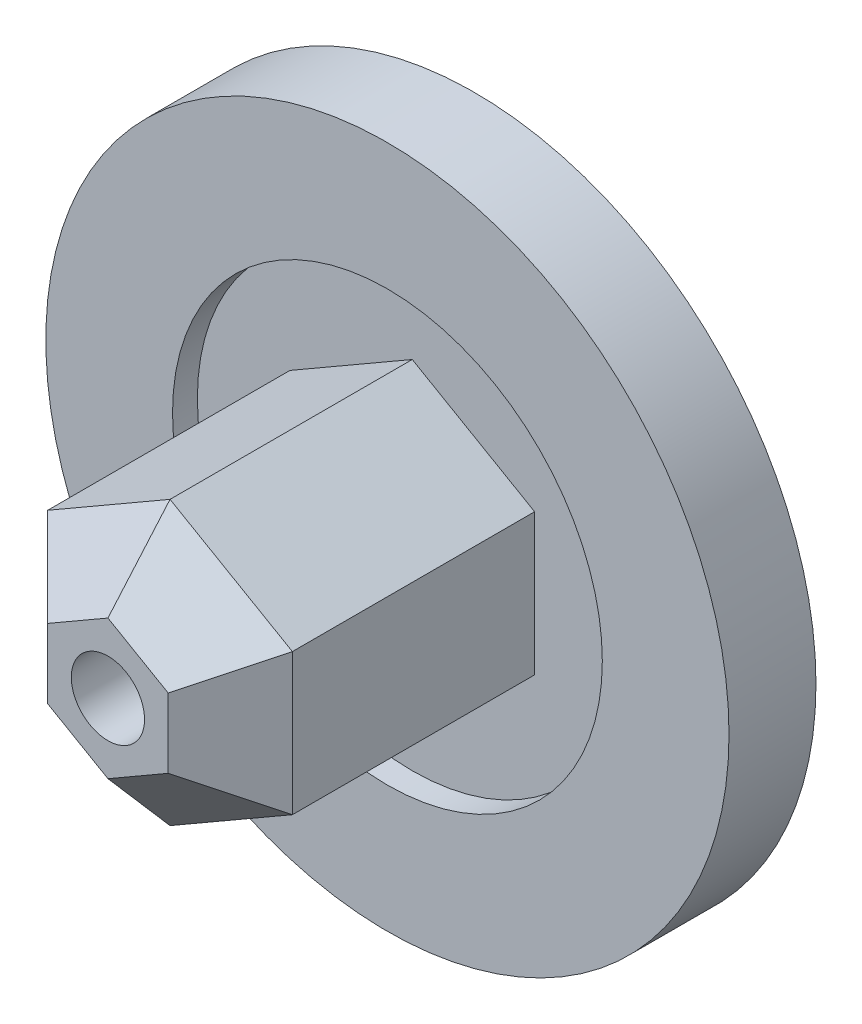
ISO-10303-21;
HEADER;
FILE_DESCRIPTION(('STEP AP214'),'2;1');
FILE_NAME('part.step','',(''),(''),'','','');
FILE_SCHEMA(('AUTOMOTIVE_DESIGN { 1 0 10303 214 1 1 1 1 }'));
ENDSEC;
DATA;
#1=APPLICATION_CONTEXT('core data for automotive mechanical design processes');
#2=APPLICATION_PROTOCOL_DEFINITION('international standard','automotive_design',2000,#1);
#3=PRODUCT_CONTEXT('',#1,'mechanical');
#4=PRODUCT('Part','Part','',(#3));
#5=PRODUCT_RELATED_PRODUCT_CATEGORY('part','',(#4));
#6=PRODUCT_DEFINITION_FORMATION('','',#4);
#7=PRODUCT_DEFINITION_CONTEXT('part definition',#1,'design');
#8=PRODUCT_DEFINITION('design','',#6,#7);
#9=PRODUCT_DEFINITION_SHAPE('','',#8);
#10=(LENGTH_UNIT() NAMED_UNIT(*) SI_UNIT(.MILLI.,.METRE.));
#11=(NAMED_UNIT(*) PLANE_ANGLE_UNIT() SI_UNIT($,.RADIAN.));
#12=(NAMED_UNIT(*) SI_UNIT($,.STERADIAN.) SOLID_ANGLE_UNIT());
#13=UNCERTAINTY_MEASURE_WITH_UNIT(LENGTH_MEASURE(1.E-05),#10,'distance_accuracy_value','');
#14=(GEOMETRIC_REPRESENTATION_CONTEXT(3) GLOBAL_UNCERTAINTY_ASSIGNED_CONTEXT((#13)) GLOBAL_UNIT_ASSIGNED_CONTEXT((#10,
#11,#12)) REPRESENTATION_CONTEXT('',''));
#15=CARTESIAN_POINT('',(0.,0.,0.));
#16=DIRECTION('',(0.,0.,1.));
#17=DIRECTION('',(1.,0.,0.));
#18=AXIS2_PLACEMENT_3D('',#15,#16,#17);
#19=CARTESIAN_POINT('',(0.,0.,0.));
#20=DIRECTION('',(0.,0.,1.));
#21=DIRECTION('',(1.,0.,0.));
#22=AXIS2_PLACEMENT_3D('',#19,#20,#21);
#23=PLANE('',#22);
#24=CARTESIAN_POINT('',(0.,0.,0.));
#25=DIRECTION('',(0.,0.,1.));
#26=DIRECTION('',(1.,0.,0.));
#27=AXIS2_PLACEMENT_3D('',#24,#25,#26);
#28=CIRCLE('',#27,23.25);
#29=CARTESIAN_POINT('',(23.25,0.,0.));
#30=VERTEX_POINT('',#29);
#31=EDGE_CURVE('E47',#30,#30,#28,.F.);
#32=ORIENTED_EDGE('',*,*,#31,.T.);
#33=EDGE_LOOP('',(#32));
#34=FACE_BOUND('',#33,.T.);
#35=CARTESIAN_POINT('',(0.,0.,0.));
#36=DIRECTION('',(0.,0.,-1.));
#37=DIRECTION('',(-1.,0.,0.));
#38=AXIS2_PLACEMENT_3D('',#35,#36,#37);
#39=CIRCLE('',#38,7.05);
#40=CARTESIAN_POINT('',(-7.05,0.,0.));
#41=VERTEX_POINT('',#40);
#42=EDGE_CURVE('E478',#41,#41,#39,.T.);
#43=ORIENTED_EDGE('',*,*,#42,.F.);
#44=EDGE_LOOP('',(#43));
#45=FACE_BOUND('',#44,.T.);
#46=ADVANCED_FACE('F38',(#34,#45),#23,.F.);
#47=CARTESIAN_POINT('',(0.,0.,5.));
#48=DIRECTION('',(0.,0.,1.));
#49=DIRECTION('',(1.,0.,0.));
#50=AXIS2_PLACEMENT_3D('',#47,#48,#49);
#51=PLANE('',#50);
#52=CARTESIAN_POINT('',(0.,0.,5.));
#53=DIRECTION('',(0.,0.,1.));
#54=DIRECTION('',(1.,0.,0.));
#55=AXIS2_PLACEMENT_3D('',#52,#53,#54);
#56=CIRCLE('',#55,17.3);
#57=CARTESIAN_POINT('',(17.3,0.,5.));
#58=VERTEX_POINT('',#57);
#59=EDGE_CURVE('E219',#58,#58,#56,.T.);
#60=ORIENTED_EDGE('',*,*,#59,.T.);
#61=EDGE_LOOP('',(#60));
#62=FACE_BOUND('',#61,.T.);
#63=DIRECTION('',(-0.866025403784439,-0.5,0.));
#64=VECTOR('',#63,1.);
#65=CARTESIAN_POINT('',(0.,11.3738003030356,5.));
#66=LINE('',#65,#64);
#67=CARTESIAN_POINT('',(0.,11.3738003030356,5.));
#68=VERTEX_POINT('',#67);
#69=CARTESIAN_POINT('',(-9.85,5.68690015151781,5.));
#70=VERTEX_POINT('',#69);
#71=EDGE_CURVE('E194',#68,#70,#66,.T.);
#72=ORIENTED_EDGE('',*,*,#71,.F.);
#73=DIRECTION('',(-0.866025403784439,0.5,0.));
#74=VECTOR('',#73,1.);
#75=CARTESIAN_POINT('',(9.84999999999999,5.68690015151782,5.));
#76=LINE('',#75,#74);
#77=CARTESIAN_POINT('',(9.84999999999999,5.68690015151782,5.));
#78=VERTEX_POINT('',#77);
#79=EDGE_CURVE('E190',#78,#68,#76,.T.);
#80=ORIENTED_EDGE('',*,*,#79,.F.);
#81=DIRECTION('',(0.,1.,0.));
#82=VECTOR('',#81,1.);
#83=CARTESIAN_POINT('',(9.85,-5.68690015151781,5.));
#84=LINE('',#83,#82);
#85=CARTESIAN_POINT('',(9.85,-5.68690015151781,5.));
#86=VERTEX_POINT('',#85);
#87=EDGE_CURVE('E81',#86,#78,#84,.T.);
#88=ORIENTED_EDGE('',*,*,#87,.F.);
#89=DIRECTION('',(0.866025403784439,0.5,0.));
#90=VECTOR('',#89,1.);
#91=CARTESIAN_POINT('',(0.,-11.3738003030356,5.));
#92=LINE('',#91,#90);
#93=CARTESIAN_POINT('',(0.,-11.3738003030356,5.));
#94=VERTEX_POINT('',#93);
#95=EDGE_CURVE('E202',#94,#86,#92,.T.);
#96=ORIENTED_EDGE('',*,*,#95,.F.);
#97=DIRECTION('',(0.866025403784439,-0.5,0.));
#98=VECTOR('',#97,1.);
#99=CARTESIAN_POINT('',(-9.85,-5.68690015151782,5.));
#100=LINE('',#99,#98);
#101=CARTESIAN_POINT('',(-9.85,-5.68690015151782,5.));
#102=VERTEX_POINT('',#101);
#103=EDGE_CURVE('E199',#102,#94,#100,.T.);
#104=ORIENTED_EDGE('',*,*,#103,.F.);
#105=DIRECTION('',(0.,-1.,0.));
#106=VECTOR('',#105,1.);
#107=CARTESIAN_POINT('',(-9.85,5.68690015151781,5.));
#108=LINE('',#107,#106);
#109=EDGE_CURVE('E105',#70,#102,#108,.T.);
#110=ORIENTED_EDGE('',*,*,#109,.F.);
#111=EDGE_LOOP('',(#72,#80,#88,#96,#104,#110));
#112=FACE_BOUND('',#111,.T.);
#113=ADVANCED_FACE('F257',(#62,#112),#51,.T.);
#114=CARTESIAN_POINT('',(0.,0.,7.));
#115=DIRECTION('',(0.,0.,-1.));
#116=DIRECTION('',(-1.,0.,0.));
#117=AXIS2_PLACEMENT_3D('',#114,#115,#116);
#118=CYLINDRICAL_SURFACE('',#117,27.5);
#119=CARTESIAN_POINT('',(0.,0.,7.));
#120=DIRECTION('',(0.,0.,1.));
#121=DIRECTION('',(1.,0.,0.));
#122=AXIS2_PLACEMENT_3D('',#119,#120,#121);
#123=CIRCLE('',#122,27.5);
#124=CARTESIAN_POINT('',(27.5,0.,7.));
#125=VERTEX_POINT('',#124);
#126=EDGE_CURVE('E227',#125,#125,#123,.T.);
#127=ORIENTED_EDGE('',*,*,#126,.F.);
#128=EDGE_LOOP('',(#127));
#129=FACE_BOUND('',#128,.T.);
#130=CARTESIAN_POINT('',(0.,0.,0.));
#131=DIRECTION('',(0.,0.,1.));
#132=DIRECTION('',(1.,0.,0.));
#133=AXIS2_PLACEMENT_3D('',#130,#131,#132);
#134=CIRCLE('',#133,27.5);
#135=CARTESIAN_POINT('',(27.5,0.,0.));
#136=VERTEX_POINT('',#135);
#137=EDGE_CURVE('E223',#136,#136,#134,.T.);
#138=ORIENTED_EDGE('',*,*,#137,.T.);
#139=EDGE_LOOP('',(#138));
#140=FACE_BOUND('',#139,.T.);
#141=ADVANCED_FACE('F265',(#129,#140),#118,.T.);
#142=CARTESIAN_POINT('',(0.,0.,7.));
#143=DIRECTION('',(0.,0.,1.));
#144=DIRECTION('',(1.,0.,0.));
#145=AXIS2_PLACEMENT_3D('',#142,#143,#144);
#146=PLANE('',#145);
#147=CARTESIAN_POINT('',(0.,0.,7.));
#148=DIRECTION('',(0.,0.,1.));
#149=DIRECTION('',(1.,0.,0.));
#150=AXIS2_PLACEMENT_3D('',#147,#148,#149);
#151=CIRCLE('',#150,17.3);
#152=CARTESIAN_POINT('',(17.3,0.,7.));
#153=VERTEX_POINT('',#152);
#154=EDGE_CURVE('E218',#153,#153,#151,.T.);
#155=ORIENTED_EDGE('',*,*,#154,.F.);
#156=EDGE_LOOP('',(#155));
#157=FACE_BOUND('',#156,.T.);
#158=ORIENTED_EDGE('',*,*,#126,.T.);
#159=EDGE_LOOP('',(#158));
#160=FACE_BOUND('',#159,.T.);
#161=ADVANCED_FACE('F271',(#157,#160),#146,.T.);
#162=CARTESIAN_POINT('',(0.,0.,0.));
#163=DIRECTION('',(0.,0.,1.));
#164=DIRECTION('',(1.,0.,0.));
#165=AXIS2_PLACEMENT_3D('',#162,#163,#164);
#166=CIRCLE('',#165,26.05);
#167=CARTESIAN_POINT('',(26.05,0.,0.));
#168=VERTEX_POINT('',#167);
#169=EDGE_CURVE('E238',#168,#168,#166,.T.);
#170=ORIENTED_EDGE('',*,*,#169,.T.);
#171=EDGE_LOOP('',(#170));
#172=FACE_BOUND('',#171,.T.);
#173=ORIENTED_EDGE('',*,*,#137,.F.);
#174=EDGE_LOOP('',(#173));
#175=FACE_BOUND('',#174,.T.);
#176=ADVANCED_FACE('F259',(#172,#175),#23,.F.);
#177=CARTESIAN_POINT('',(0.,0.,5.));
#178=DIRECTION('',(0.,0.,1.));
#179=DIRECTION('',(1.,0.,0.));
#180=AXIS2_PLACEMENT_3D('',#177,#178,#179);
#181=CYLINDRICAL_SURFACE('',#180,17.3);
#182=ORIENTED_EDGE('',*,*,#59,.F.);
#183=EDGE_LOOP('',(#182));
#184=FACE_BOUND('',#183,.T.);
#185=ORIENTED_EDGE('',*,*,#154,.T.);
#186=EDGE_LOOP('',(#185));
#187=FACE_BOUND('',#186,.T.);
#188=ADVANCED_FACE('F270',(#184,#187),#181,.F.);
#189=CARTESIAN_POINT('',(9.84999999999999,5.68690015151782,24.5));
#190=DIRECTION('',(-0.5,-0.866025403784439,0.));
#191=DIRECTION('',(0.866025403784439,-0.5,0.));
#192=AXIS2_PLACEMENT_3D('',#189,#190,#191);
#193=PLANE('',#192);
#194=ORIENTED_EDGE('',*,*,#79,.T.);
#195=DIRECTION('',(0.,0.,-1.));
#196=VECTOR('',#195,1.);
#197=CARTESIAN_POINT('',(0.,11.3738003030356,24.5));
#198=LINE('',#197,#196);
#199=CARTESIAN_POINT('',(0.,11.3738003030356,24.5));
#200=VERTEX_POINT('',#199);
#201=EDGE_CURVE('E215',#200,#68,#198,.T.);
#202=ORIENTED_EDGE('',*,*,#201,.F.);
#203=DIRECTION('',(-0.866025403784439,0.5,0.));
#204=VECTOR('',#203,1.);
#205=CARTESIAN_POINT('',(9.84999999999999,5.68690015151782,24.5));
#206=LINE('',#205,#204);
#207=CARTESIAN_POINT('',(9.84999999999999,5.68690015151782,24.5));
#208=VERTEX_POINT('',#207);
#209=EDGE_CURVE('E176',#208,#200,#206,.T.);
#210=ORIENTED_EDGE('',*,*,#209,.F.);
#211=DIRECTION('',(0.,0.,-1.));
#212=VECTOR('',#211,1.);
#213=CARTESIAN_POINT('',(9.84999999999999,5.68690015151782,24.5));
#214=LINE('',#213,#212);
#215=EDGE_CURVE('E189',#208,#78,#214,.T.);
#216=ORIENTED_EDGE('',*,*,#215,.T.);
#217=EDGE_LOOP('',(#194,#202,#210,#216));
#218=FACE_BOUND('',#217,.T.);
#219=ADVANCED_FACE('F277',(#218),#193,.F.);
#220=CARTESIAN_POINT('',(0.,11.3738003030356,24.5));
#221=DIRECTION('',(0.5,-0.866025403784439,0.));
#222=DIRECTION('',(0.866025403784439,0.5,0.));
#223=AXIS2_PLACEMENT_3D('',#220,#221,#222);
#224=PLANE('',#223);
#225=ORIENTED_EDGE('',*,*,#71,.T.);
#226=DIRECTION('',(0.,0.,-1.));
#227=VECTOR('',#226,1.);
#228=CARTESIAN_POINT('',(-9.85,5.68690015151781,24.5));
#229=LINE('',#228,#227);
#230=CARTESIAN_POINT('',(-9.85,5.68690015151781,24.5));
#231=VERTEX_POINT('',#230);
#232=EDGE_CURVE('E109',#231,#70,#229,.T.);
#233=ORIENTED_EDGE('',*,*,#232,.F.);
#234=DIRECTION('',(-0.866025403784439,-0.5,0.));
#235=VECTOR('',#234,1.);
#236=CARTESIAN_POINT('',(0.,11.3738003030356,24.5));
#237=LINE('',#236,#235);
#238=EDGE_CURVE('E89',#200,#231,#237,.T.);
#239=ORIENTED_EDGE('',*,*,#238,.F.);
#240=ORIENTED_EDGE('',*,*,#201,.T.);
#241=EDGE_LOOP('',(#225,#233,#239,#240));
#242=FACE_BOUND('',#241,.T.);
#243=ADVANCED_FACE('F312',(#242),#224,.F.);
#244=CARTESIAN_POINT('',(-9.85,5.68690015151781,24.5));
#245=DIRECTION('',(1.,0.,0.));
#246=DIRECTION('',(0.,1.,0.));
#247=AXIS2_PLACEMENT_3D('',#244,#245,#246);
#248=PLANE('',#247);
#249=ORIENTED_EDGE('',*,*,#109,.T.);
#250=DIRECTION('',(0.,0.,-1.));
#251=VECTOR('',#250,1.);
#252=CARTESIAN_POINT('',(-9.85,-5.68690015151782,24.5));
#253=LINE('',#252,#251);
#254=CARTESIAN_POINT('',(-9.85,-5.68690015151782,24.5));
#255=VERTEX_POINT('',#254);
#256=EDGE_CURVE('E98',#255,#102,#253,.T.);
#257=ORIENTED_EDGE('',*,*,#256,.F.);
#258=DIRECTION('',(0.,-1.,0.));
#259=VECTOR('',#258,1.);
#260=CARTESIAN_POINT('',(-9.85,5.68690015151781,24.5));
#261=LINE('',#260,#259);
#262=EDGE_CURVE('E103',#231,#255,#261,.T.);
#263=ORIENTED_EDGE('',*,*,#262,.F.);
#264=ORIENTED_EDGE('',*,*,#232,.T.);
#265=EDGE_LOOP('',(#249,#257,#263,#264));
#266=FACE_BOUND('',#265,.T.);
#267=ADVANCED_FACE('F100',(#266),#248,.F.);
#268=CARTESIAN_POINT('',(-9.85,-5.68690015151782,24.5));
#269=DIRECTION('',(0.5,0.866025403784439,0.));
#270=DIRECTION('',(-0.866025403784439,0.5,0.));
#271=AXIS2_PLACEMENT_3D('',#268,#269,#270);
#272=PLANE('',#271);
#273=ORIENTED_EDGE('',*,*,#103,.T.);
#274=DIRECTION('',(0.,0.,-1.));
#275=VECTOR('',#274,1.);
#276=CARTESIAN_POINT('',(0.,-11.3738003030356,24.5));
#277=LINE('',#276,#275);
#278=CARTESIAN_POINT('',(0.,-11.3738003030356,24.5));
#279=VERTEX_POINT('',#278);
#280=EDGE_CURVE('E110',#279,#94,#277,.T.);
#281=ORIENTED_EDGE('',*,*,#280,.F.);
#282=DIRECTION('',(0.866025403784439,-0.5,0.));
#283=VECTOR('',#282,1.);
#284=CARTESIAN_POINT('',(-9.85,-5.68690015151782,24.5));
#285=LINE('',#284,#283);
#286=EDGE_CURVE('E113',#255,#279,#285,.T.);
#287=ORIENTED_EDGE('',*,*,#286,.F.);
#288=ORIENTED_EDGE('',*,*,#256,.T.);
#289=EDGE_LOOP('',(#273,#281,#287,#288));
#290=FACE_BOUND('',#289,.T.);
#291=ADVANCED_FACE('F114',(#290),#272,.F.);
#292=CARTESIAN_POINT('',(0.,-11.3738003030356,24.5));
#293=DIRECTION('',(-0.5,0.866025403784439,0.));
#294=DIRECTION('',(-0.866025403784439,-0.5,0.));
#295=AXIS2_PLACEMENT_3D('',#292,#293,#294);
#296=PLANE('',#295);
#297=ORIENTED_EDGE('',*,*,#95,.T.);
#298=DIRECTION('',(0.,0.,-1.));
#299=VECTOR('',#298,1.);
#300=CARTESIAN_POINT('',(9.85,-5.68690015151781,24.5));
#301=LINE('',#300,#299);
#302=CARTESIAN_POINT('',(9.85,-5.68690015151781,24.5));
#303=VERTEX_POINT('',#302);
#304=EDGE_CURVE('E54',#303,#86,#301,.T.);
#305=ORIENTED_EDGE('',*,*,#304,.F.);
#306=DIRECTION('',(0.866025403784439,0.5,0.));
#307=VECTOR('',#306,1.);
#308=CARTESIAN_POINT('',(0.,-11.3738003030356,24.5));
#309=LINE('',#308,#307);
#310=EDGE_CURVE('E121',#279,#303,#309,.T.);
#311=ORIENTED_EDGE('',*,*,#310,.F.);
#312=ORIENTED_EDGE('',*,*,#280,.T.);
#313=EDGE_LOOP('',(#297,#305,#311,#312));
#314=FACE_BOUND('',#313,.T.);
#315=ADVANCED_FACE('F332',(#314),#296,.F.);
#316=CARTESIAN_POINT('',(9.85,-5.68690015151781,24.5));
#317=DIRECTION('',(-1.,0.,0.));
#318=DIRECTION('',(0.,-1.,0.));
#319=AXIS2_PLACEMENT_3D('',#316,#317,#318);
#320=PLANE('',#319);
#321=ORIENTED_EDGE('',*,*,#87,.T.);
#322=ORIENTED_EDGE('',*,*,#215,.F.);
#323=DIRECTION('',(0.,1.,0.));
#324=VECTOR('',#323,1.);
#325=CARTESIAN_POINT('',(9.85,-5.68690015151781,24.5));
#326=LINE('',#325,#324);
#327=EDGE_CURVE('E185',#303,#208,#326,.T.);
#328=ORIENTED_EDGE('',*,*,#327,.F.);
#329=ORIENTED_EDGE('',*,*,#304,.T.);
#330=EDGE_LOOP('',(#321,#322,#328,#329));
#331=FACE_BOUND('',#330,.T.);
#332=ADVANCED_FACE('F339',(#331),#320,.F.);
#333=CARTESIAN_POINT('',(9.85,-5.68690015151781,24.5));
#334=DIRECTION('',(0.707106781186546,0.,0.707106781186549));
#335=DIRECTION('',(0.707106781186549,0.,-0.707106781186546));
#336=AXIS2_PLACEMENT_3D('',#333,#334,#335);
#337=PLANE('',#336);
#338=ORIENTED_EDGE('',*,*,#327,.T.);
#339=DIRECTION('',(0.654653670707978,0.377964473009228,-0.654653670707976));
#340=VECTOR('',#339,1.);
#341=CARTESIAN_POINT('',(9.84999999999999,5.68690015151782,24.5));
#342=LINE('',#341,#340);
#343=CARTESIAN_POINT('',(4.84999999999998,2.80014880556968,29.5));
#344=VERTEX_POINT('',#343);
#345=EDGE_CURVE('E152',#344,#208,#342,.T.);
#346=ORIENTED_EDGE('',*,*,#345,.F.);
#347=DIRECTION('',(0.,-1.,0.));
#348=VECTOR('',#347,1.);
#349=CARTESIAN_POINT('',(4.84999999999998,-5.68690015151782,29.5));
#350=LINE('',#349,#348);
#351=CARTESIAN_POINT('',(4.84999999999998,-2.80014880556968,29.5));
#352=VERTEX_POINT('',#351);
#353=EDGE_CURVE('E153',#352,#344,#350,.F.);
#354=ORIENTED_EDGE('',*,*,#353,.F.);
#355=DIRECTION('',(0.654653670707978,-0.377964473009228,-0.654653670707976));
#356=VECTOR('',#355,1.);
#357=CARTESIAN_POINT('',(9.85,-5.68690015151781,24.5));
#358=LINE('',#357,#356);
#359=EDGE_CURVE('E145',#352,#303,#358,.T.);
#360=ORIENTED_EDGE('',*,*,#359,.T.);
#361=EDGE_LOOP('',(#338,#346,#354,#360));
#362=FACE_BOUND('',#361,.T.);
#363=ADVANCED_FACE('F346',(#362),#337,.T.);
#364=CARTESIAN_POINT('',(9.84999999999999,5.68690015151782,24.5));
#365=DIRECTION('',(0.353553390593273,0.612372435695794,0.707106781186549));
#366=DIRECTION('',(0.,-0.755928946018456,0.654653670707976));
#367=AXIS2_PLACEMENT_3D('',#364,#365,#366);
#368=PLANE('',#367);
#369=ORIENTED_EDGE('',*,*,#209,.T.);
#370=DIRECTION('',(0.,0.755928946018456,-0.654653670707976));
#371=VECTOR('',#370,1.);
#372=CARTESIAN_POINT('',(0.,11.3738003030356,24.5));
#373=LINE('',#372,#371);
#374=CARTESIAN_POINT('',(0.,5.60029761113935,29.5));
#375=VERTEX_POINT('',#374);
#376=EDGE_CURVE('E143',#375,#200,#373,.T.);
#377=ORIENTED_EDGE('',*,*,#376,.F.);
#378=DIRECTION('',(0.866025403784439,-0.5,0.));
#379=VECTOR('',#378,1.);
#380=CARTESIAN_POINT('',(7.34999999999999,1.35677313259561,29.5));
#381=LINE('',#380,#379);
#382=EDGE_CURVE('E157',#344,#375,#381,.F.);
#383=ORIENTED_EDGE('',*,*,#382,.F.);
#384=ORIENTED_EDGE('',*,*,#345,.T.);
#385=EDGE_LOOP('',(#369,#377,#383,#384));
#386=FACE_BOUND('',#385,.T.);
#387=ADVANCED_FACE('F353',(#386),#368,.T.);
#388=CARTESIAN_POINT('',(0.,11.3738003030356,24.5));
#389=DIRECTION('',(-0.353553390593273,0.612372435695793,0.707106781186549));
#390=DIRECTION('',(0.,-0.755928946018456,0.654653670707976));
#391=AXIS2_PLACEMENT_3D('',#388,#389,#390);
#392=PLANE('',#391);
#393=ORIENTED_EDGE('',*,*,#238,.T.);
#394=DIRECTION('',(-0.654653670707978,0.377964473009228,-0.654653670707976));
#395=VECTOR('',#394,1.);
#396=CARTESIAN_POINT('',(-9.85,5.68690015151781,24.5));
#397=LINE('',#396,#395);
#398=CARTESIAN_POINT('',(-4.84999999999998,2.80014880556967,29.5));
#399=VERTEX_POINT('',#398);
#400=EDGE_CURVE('E132',#399,#231,#397,.T.);
#401=ORIENTED_EDGE('',*,*,#400,.F.);
#402=DIRECTION('',(0.866025403784439,0.5,0.));
#403=VECTOR('',#402,1.);
#404=CARTESIAN_POINT('',(2.50000000000001,7.04367328411342,29.5));
#405=LINE('',#404,#403);
#406=EDGE_CURVE('E162',#375,#399,#405,.F.);
#407=ORIENTED_EDGE('',*,*,#406,.F.);
#408=ORIENTED_EDGE('',*,*,#376,.T.);
#409=EDGE_LOOP('',(#393,#401,#407,#408));
#410=FACE_BOUND('',#409,.T.);
#411=ADVANCED_FACE('F361',(#410),#392,.T.);
#412=CARTESIAN_POINT('',(-9.85,5.68690015151781,24.5));
#413=DIRECTION('',(-0.707106781186546,0.,0.707106781186549));
#414=DIRECTION('',(0.707106781186549,0.,0.707106781186546));
#415=AXIS2_PLACEMENT_3D('',#412,#413,#414);
#416=PLANE('',#415);
#417=ORIENTED_EDGE('',*,*,#262,.T.);
#418=DIRECTION('',(-0.654653670707978,-0.377964473009228,-0.654653670707976));
#419=VECTOR('',#418,1.);
#420=CARTESIAN_POINT('',(-9.85,-5.68690015151782,24.5));
#421=LINE('',#420,#419);
#422=CARTESIAN_POINT('',(-4.84999999999998,-2.80014880556968,29.5));
#423=VERTEX_POINT('',#422);
#424=EDGE_CURVE('E129',#423,#255,#421,.T.);
#425=ORIENTED_EDGE('',*,*,#424,.F.);
#426=DIRECTION('',(0.,1.,0.));
#427=VECTOR('',#426,1.);
#428=CARTESIAN_POINT('',(-4.84999999999998,5.68690015151782,29.5));
#429=LINE('',#428,#427);
#430=EDGE_CURVE('E166',#399,#423,#429,.F.);
#431=ORIENTED_EDGE('',*,*,#430,.F.);
#432=ORIENTED_EDGE('',*,*,#400,.T.);
#433=EDGE_LOOP('',(#417,#425,#431,#432));
#434=FACE_BOUND('',#433,.T.);
#435=ADVANCED_FACE('F126',(#434),#416,.T.);
#436=CARTESIAN_POINT('',(-9.85,-5.68690015151782,24.5));
#437=DIRECTION('',(-0.353553390593273,-0.612372435695793,0.707106781186549));
#438=DIRECTION('',(0.,-0.755928946018456,-0.654653670707976));
#439=AXIS2_PLACEMENT_3D('',#436,#437,#438);
#440=PLANE('',#439);
#441=ORIENTED_EDGE('',*,*,#286,.T.);
#442=DIRECTION('',(0.,-0.755928946018456,-0.654653670707976));
#443=VECTOR('',#442,1.);
#444=CARTESIAN_POINT('',(0.,-11.3738003030356,24.5));
#445=LINE('',#444,#443);
#446=CARTESIAN_POINT('',(0.,-5.60029761113935,29.5));
#447=VERTEX_POINT('',#446);
#448=EDGE_CURVE('E139',#447,#279,#445,.T.);
#449=ORIENTED_EDGE('',*,*,#448,.F.);
#450=DIRECTION('',(-0.866025403784439,0.5,0.));
#451=VECTOR('',#450,1.);
#452=CARTESIAN_POINT('',(-7.34999999999999,-1.35677313259561,29.5));
#453=LINE('',#452,#451);
#454=EDGE_CURVE('E137',#423,#447,#453,.F.);
#455=ORIENTED_EDGE('',*,*,#454,.F.);
#456=ORIENTED_EDGE('',*,*,#424,.T.);
#457=EDGE_LOOP('',(#441,#449,#455,#456));
#458=FACE_BOUND('',#457,.T.);
#459=ADVANCED_FACE('F135',(#458),#440,.T.);
#460=CARTESIAN_POINT('',(0.,-11.3738003030356,24.5));
#461=DIRECTION('',(0.353553390593273,-0.612372435695793,0.707106781186549));
#462=DIRECTION('',(0.,-0.755928946018456,-0.654653670707976));
#463=AXIS2_PLACEMENT_3D('',#460,#461,#462);
#464=PLANE('',#463);
#465=ORIENTED_EDGE('',*,*,#310,.T.);
#466=ORIENTED_EDGE('',*,*,#359,.F.);
#467=DIRECTION('',(-0.866025403784439,-0.5,0.));
#468=VECTOR('',#467,1.);
#469=CARTESIAN_POINT('',(-2.50000000000001,-7.04367328411342,29.5));
#470=LINE('',#469,#468);
#471=EDGE_CURVE('E172',#447,#352,#470,.F.);
#472=ORIENTED_EDGE('',*,*,#471,.F.);
#473=ORIENTED_EDGE('',*,*,#448,.T.);
#474=EDGE_LOOP('',(#465,#466,#472,#473));
#475=FACE_BOUND('',#474,.T.);
#476=ADVANCED_FACE('F382',(#475),#464,.T.);
#477=CARTESIAN_POINT('',(0.,0.,29.5));
#478=DIRECTION('',(0.,0.,1.));
#479=DIRECTION('',(1.,0.,0.));
#480=AXIS2_PLACEMENT_3D('',#477,#478,#479);
#481=PLANE('',#480);
#482=CARTESIAN_POINT('',(0.,0.,29.5));
#483=DIRECTION('',(0.,0.,-1.));
#484=DIRECTION('',(-1.,0.,0.));
#485=AXIS2_PLACEMENT_3D('',#482,#483,#484);
#486=CIRCLE('',#485,2.95);
#487=CARTESIAN_POINT('',(-2.95,0.,29.5));
#488=VERTEX_POINT('',#487);
#489=EDGE_CURVE('E474',#488,#488,#486,.T.);
#490=ORIENTED_EDGE('',*,*,#489,.T.);
#491=EDGE_LOOP('',(#490));
#492=FACE_BOUND('',#491,.T.);
#493=ORIENTED_EDGE('',*,*,#353,.T.);
#494=ORIENTED_EDGE('',*,*,#382,.T.);
#495=ORIENTED_EDGE('',*,*,#406,.T.);
#496=ORIENTED_EDGE('',*,*,#430,.T.);
#497=ORIENTED_EDGE('',*,*,#454,.T.);
#498=ORIENTED_EDGE('',*,*,#471,.T.);
#499=EDGE_LOOP('',(#493,#494,#495,#496,#497,#498));
#500=FACE_BOUND('',#499,.T.);
#501=ADVANCED_FACE('F389',(#492,#500),#481,.T.);
#502=CARTESIAN_POINT('',(0.,0.,16.5));
#503=DIRECTION('',(0.,0.,-1.));
#504=DIRECTION('',(-1.,0.,0.));
#505=AXIS2_PLACEMENT_3D('',#502,#503,#504);
#506=CYLINDRICAL_SURFACE('',#505,7.05);
#507=CARTESIAN_POINT('',(0.,0.,16.5));
#508=DIRECTION('',(0.,0.,-1.));
#509=DIRECTION('',(-1.,0.,0.));
#510=AXIS2_PLACEMENT_3D('',#507,#508,#509);
#511=CIRCLE('',#510,7.05);
#512=CARTESIAN_POINT('',(-7.05,0.,16.5));
#513=VERTEX_POINT('',#512);
#514=EDGE_CURVE('E158',#513,#513,#511,.T.);
#515=ORIENTED_EDGE('',*,*,#514,.F.);
#516=EDGE_LOOP('',(#515));
#517=FACE_BOUND('',#516,.T.);
#518=ORIENTED_EDGE('',*,*,#42,.T.);
#519=EDGE_LOOP('',(#518));
#520=FACE_BOUND('',#519,.T.);
#521=ADVANCED_FACE('F398',(#517,#520),#506,.F.);
#522=CARTESIAN_POINT('',(0.,0.,16.5));
#523=DIRECTION('',(0.,0.,-1.));
#524=DIRECTION('',(-1.,0.,0.));
#525=AXIS2_PLACEMENT_3D('',#522,#523,#524);
#526=PLANE('',#525);
#527=CARTESIAN_POINT('',(0.,0.,16.5));
#528=DIRECTION('',(0.,0.,-1.));
#529=DIRECTION('',(-1.,0.,0.));
#530=AXIS2_PLACEMENT_3D('',#527,#528,#529);
#531=CIRCLE('',#530,2.95);
#532=CARTESIAN_POINT('',(-2.95,0.,16.5));
#533=VERTEX_POINT('',#532);
#534=EDGE_CURVE('E471',#533,#533,#531,.T.);
#535=ORIENTED_EDGE('',*,*,#534,.F.);
#536=EDGE_LOOP('',(#535));
#537=FACE_BOUND('',#536,.T.);
#538=ORIENTED_EDGE('',*,*,#514,.T.);
#539=EDGE_LOOP('',(#538));
#540=FACE_BOUND('',#539,.T.);
#541=ADVANCED_FACE('F406',(#537,#540),#526,.T.);
#542=CARTESIAN_POINT('',(0.,0.,29.5));
#543=DIRECTION('',(0.,0.,-1.));
#544=DIRECTION('',(-1.,0.,0.));
#545=AXIS2_PLACEMENT_3D('',#542,#543,#544);
#546=CYLINDRICAL_SURFACE('',#545,2.95);
#547=ORIENTED_EDGE('',*,*,#489,.F.);
#548=EDGE_LOOP('',(#547));
#549=FACE_BOUND('',#548,.T.);
#550=ORIENTED_EDGE('',*,*,#534,.T.);
#551=EDGE_LOOP('',(#550));
#552=FACE_BOUND('',#551,.T.);
#553=ADVANCED_FACE('F413',(#549,#552),#546,.F.);
#554=CARTESIAN_POINT('',(0.,0.,5.));
#555=DIRECTION('',(0.,0.,-1.));
#556=DIRECTION('',(-1.,0.,0.));
#557=AXIS2_PLACEMENT_3D('',#554,#555,#556);
#558=CYLINDRICAL_SURFACE('',#557,25.55);
#559=CARTESIAN_POINT('',(0.,0.,0.499999999999976));
#560=DIRECTION('',(0.,0.,1.));
#561=DIRECTION('',(1.,0.,0.));
#562=AXIS2_PLACEMENT_3D('',#559,#560,#561);
#563=CIRCLE('',#562,25.55);
#564=CARTESIAN_POINT('',(25.55,0.,0.499999999999976));
#565=VERTEX_POINT('',#564);
#566=EDGE_CURVE('E231',#565,#565,#563,.F.);
#567=ORIENTED_EDGE('',*,*,#566,.T.);
#568=EDGE_LOOP('',(#567));
#569=FACE_BOUND('',#568,.T.);
#570=CARTESIAN_POINT('',(0.,0.,5.));
#571=DIRECTION('',(0.,0.,-1.));
#572=DIRECTION('',(-1.,0.,0.));
#573=AXIS2_PLACEMENT_3D('',#570,#571,#572);
#574=CIRCLE('',#573,25.55);
#575=CARTESIAN_POINT('',(-25.55,0.,5.));
#576=VERTEX_POINT('',#575);
#577=EDGE_CURVE('E467',#576,#576,#574,.T.);
#578=ORIENTED_EDGE('',*,*,#577,.F.);
#579=EDGE_LOOP('',(#578));
#580=FACE_BOUND('',#579,.T.);
#581=ADVANCED_FACE('F421',(#569,#580),#558,.F.);
#582=CARTESIAN_POINT('',(0.,0.,5.));
#583=DIRECTION('',(0.,0.,-1.));
#584=DIRECTION('',(-1.,0.,0.));
#585=AXIS2_PLACEMENT_3D('',#582,#583,#584);
#586=PLANE('',#585);
#587=CARTESIAN_POINT('',(0.,0.,5.));
#588=DIRECTION('',(0.,0.,-1.));
#589=DIRECTION('',(-1.,0.,0.));
#590=AXIS2_PLACEMENT_3D('',#587,#588,#589);
#591=CIRCLE('',#590,23.75);
#592=CARTESIAN_POINT('',(-23.75,0.,5.));
#593=VERTEX_POINT('',#592);
#594=EDGE_CURVE('E465',#593,#593,#591,.T.);
#595=ORIENTED_EDGE('',*,*,#594,.F.);
#596=EDGE_LOOP('',(#595));
#597=FACE_BOUND('',#596,.T.);
#598=ORIENTED_EDGE('',*,*,#577,.T.);
#599=EDGE_LOOP('',(#598));
#600=FACE_BOUND('',#599,.T.);
#601=ADVANCED_FACE('F429',(#597,#600),#586,.T.);
#602=CARTESIAN_POINT('',(0.,0.,5.));
#603=DIRECTION('',(0.,0.,-1.));
#604=DIRECTION('',(-1.,0.,0.));
#605=AXIS2_PLACEMENT_3D('',#602,#603,#604);
#606=CYLINDRICAL_SURFACE('',#605,23.75);
#607=CARTESIAN_POINT('',(0.,0.,0.500000000000011));
#608=DIRECTION('',(0.,0.,1.));
#609=DIRECTION('',(1.,0.,0.));
#610=AXIS2_PLACEMENT_3D('',#607,#608,#609);
#611=CIRCLE('',#610,23.75);
#612=CARTESIAN_POINT('',(23.75,0.,0.500000000000011));
#613=VERTEX_POINT('',#612);
#614=EDGE_CURVE('E11',#613,#613,#611,.T.);
#615=ORIENTED_EDGE('',*,*,#614,.T.);
#616=EDGE_LOOP('',(#615));
#617=FACE_BOUND('',#616,.T.);
#618=ORIENTED_EDGE('',*,*,#594,.T.);
#619=EDGE_LOOP('',(#618));
#620=FACE_BOUND('',#619,.T.);
#621=ADVANCED_FACE('F253',(#617,#620),#606,.T.);
#622=CARTESIAN_POINT('',(0.,0.,0.499999999999976));
#623=DIRECTION('',(0.,0.,-1.));
#624=DIRECTION('',(-1.,0.,0.));
#625=AXIS2_PLACEMENT_3D('',#622,#623,#624);
#626=CONICAL_SURFACE('',#625,25.55,0.785398163397452);
#627=ORIENTED_EDGE('',*,*,#169,.F.);
#628=EDGE_LOOP('',(#627));
#629=FACE_BOUND('',#628,.T.);
#630=ORIENTED_EDGE('',*,*,#566,.F.);
#631=EDGE_LOOP('',(#630));
#632=FACE_BOUND('',#631,.T.);
#633=ADVANCED_FACE('F248',(#629,#632),#626,.F.);
#634=CARTESIAN_POINT('',(0.,0.,0.));
#635=DIRECTION('',(0.,0.,1.));
#636=DIRECTION('',(1.,0.,0.));
#637=AXIS2_PLACEMENT_3D('',#634,#635,#636);
#638=CONICAL_SURFACE('',#637,23.25,0.785398163397452);
#639=ORIENTED_EDGE('',*,*,#614,.F.);
#640=EDGE_LOOP('',(#639));
#641=FACE_BOUND('',#640,.T.);
#642=ORIENTED_EDGE('',*,*,#31,.F.);
#643=EDGE_LOOP('',(#642));
#644=FACE_BOUND('',#643,.T.);
#645=ADVANCED_FACE('F40',(#641,#644),#638,.T.);
#646=CLOSED_SHELL('',(#46,#113,#141,#161,#176,#188,#219,#243,#267,#291,#315,#332,#363,#387,#411,
#435,#459,#476,#501,#521,#541,#553,#581,#601,#621,#633,#645));
#647=MANIFOLD_SOLID_BREP('B2',#646);
#648=ADVANCED_BREP_SHAPE_REPRESENTATION('',(#18,#647),#14);
#649=SHAPE_DEFINITION_REPRESENTATION(#9,#648);
ENDSEC;
END-ISO-10303-21;
